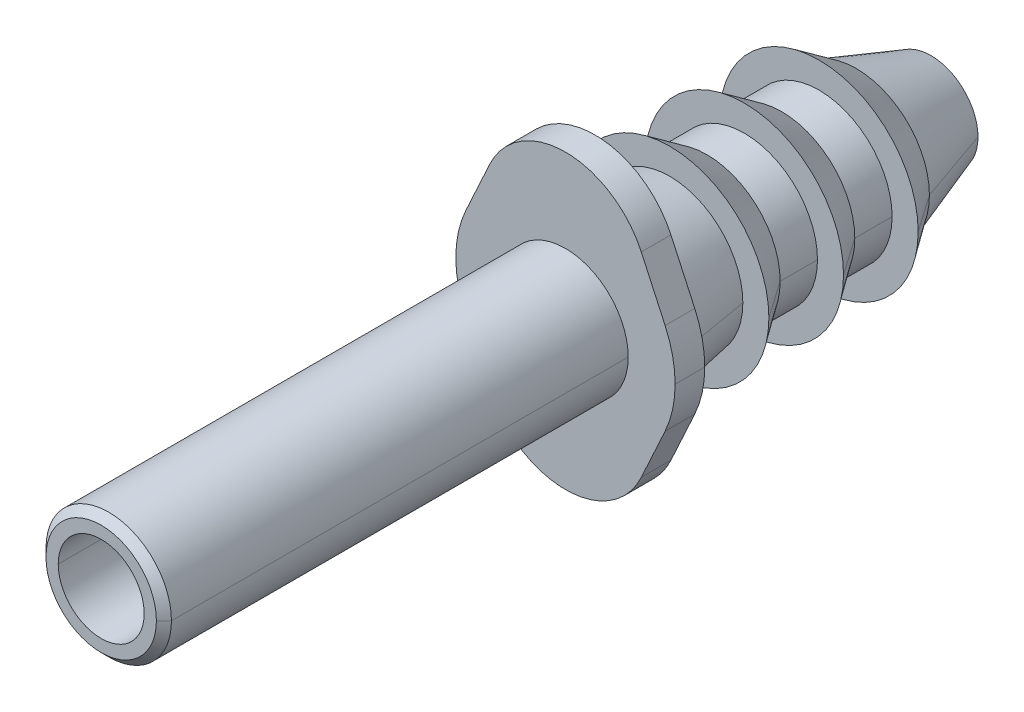
ISO-10303-21;
HEADER;
FILE_DESCRIPTION(('STEP AP214'),'2;1');
FILE_NAME('part.step','',(''),(''),'','','');
FILE_SCHEMA(('AUTOMOTIVE_DESIGN { 1 0 10303 214 1 1 1 1 }'));
ENDSEC;
DATA;
#1=APPLICATION_CONTEXT('core data for automotive mechanical design processes');
#2=APPLICATION_PROTOCOL_DEFINITION('international standard','automotive_design',2000,#1);
#3=PRODUCT_CONTEXT('',#1,'mechanical');
#4=PRODUCT('Part','Part','',(#3));
#5=PRODUCT_RELATED_PRODUCT_CATEGORY('part','',(#4));
#6=PRODUCT_DEFINITION_FORMATION('','',#4);
#7=PRODUCT_DEFINITION_CONTEXT('part definition',#1,'design');
#8=PRODUCT_DEFINITION('design','',#6,#7);
#9=PRODUCT_DEFINITION_SHAPE('','',#8);
#10=(LENGTH_UNIT() NAMED_UNIT(*) SI_UNIT(.MILLI.,.METRE.));
#11=(NAMED_UNIT(*) PLANE_ANGLE_UNIT() SI_UNIT($,.RADIAN.));
#12=(NAMED_UNIT(*) SI_UNIT($,.STERADIAN.) SOLID_ANGLE_UNIT());
#13=UNCERTAINTY_MEASURE_WITH_UNIT(LENGTH_MEASURE(1.E-05),#10,'distance_accuracy_value','');
#14=(GEOMETRIC_REPRESENTATION_CONTEXT(3) GLOBAL_UNCERTAINTY_ASSIGNED_CONTEXT((#13)) GLOBAL_UNIT_ASSIGNED_CONTEXT((#10,
#11,#12)) REPRESENTATION_CONTEXT('',''));
#15=CARTESIAN_POINT('',(0.,0.,0.));
#16=DIRECTION('',(0.,0.,1.));
#17=DIRECTION('',(1.,0.,0.));
#18=AXIS2_PLACEMENT_3D('',#15,#16,#17);
#19=CARTESIAN_POINT('',(3.83950382648321,-4.93818897637795,-21.));
#20=DIRECTION('',(0.908758302126205,-0.41732283464567,0.));
#21=DIRECTION('',(0.,0.,-1.));
#22=AXIS2_PLACEMENT_3D('',#19,#20,#21);
#23=PLANE('',#22);
#24=DIRECTION('',(-0.41732283464567,-0.908758302126205,0.));
#25=VECTOR('',#24,1.);
#26=CARTESIAN_POINT('',(6.24771332711766,0.305905511811019,-2.5));
#27=LINE('',#26,#25);
#28=CARTESIAN_POINT('',(5.04360857680044,-2.31614173228347,-2.5));
#29=VERTEX_POINT('',#28);
#30=CARTESIAN_POINT('',(3.83950382648321,-4.93818897637795,-2.5));
#31=VERTEX_POINT('',#30);
#32=EDGE_CURVE('E406',#29,#31,#27,.T.);
#33=ORIENTED_EDGE('',*,*,#32,.T.);
#34=DIRECTION('',(0.,0.,1.));
#35=VECTOR('',#34,1.);
#36=CARTESIAN_POINT('',(3.83950382648321,-4.93818897637795,-21.));
#37=LINE('',#36,#35);
#38=CARTESIAN_POINT('',(3.83950382648321,-4.93818897637795,-4.));
#39=VERTEX_POINT('',#38);
#40=EDGE_CURVE('E315',#39,#31,#37,.T.);
#41=ORIENTED_EDGE('',*,*,#40,.F.);
#42=DIRECTION('',(0.41732283464567,0.908758302126205,0.));
#43=VECTOR('',#42,1.);
#44=CARTESIAN_POINT('',(6.69688232354505,1.28401171802343,-4.));
#45=LINE('',#44,#43);
#46=CARTESIAN_POINT('',(5.04360857680044,-2.31614173228347,-4.));
#47=VERTEX_POINT('',#46);
#48=EDGE_CURVE('E325',#39,#47,#45,.T.);
#49=ORIENTED_EDGE('',*,*,#48,.T.);
#50=DIRECTION('',(0.,0.,1.));
#51=VECTOR('',#50,1.);
#52=CARTESIAN_POINT('',(5.04360857680044,-2.31614173228347,-21.));
#53=LINE('',#52,#51);
#54=EDGE_CURVE('E507',#47,#29,#53,.T.);
#55=ORIENTED_EDGE('',*,*,#54,.T.);
#56=EDGE_LOOP('',(#33,#41,#49,#55));
#57=FACE_BOUND('',#56,.T.);
#58=ADVANCED_FACE('F16',(#57),#23,.T.);
#59=CARTESIAN_POINT('',(0.,0.,-21.));
#60=DIRECTION('',(0.,0.,1.));
#61=DIRECTION('',(1.,0.,0.));
#62=AXIS2_PLACEMENT_3D('',#59,#60,#61);
#63=CYLINDRICAL_SURFACE('',#62,5.55);
#64=DIRECTION('',(0.,0.,1.));
#65=VECTOR('',#64,1.);
#66=CARTESIAN_POINT('',(5.55,0.,-21.));
#67=LINE('',#66,#65);
#68=CARTESIAN_POINT('',(5.55,0.,-4.));
#69=VERTEX_POINT('',#68);
#70=CARTESIAN_POINT('',(5.55,0.,-2.5));
#71=VERTEX_POINT('',#70);
#72=EDGE_CURVE('E519',#69,#71,#67,.T.);
#73=ORIENTED_EDGE('',*,*,#72,.F.);
#74=CARTESIAN_POINT('',(0.,0.,-4.));
#75=DIRECTION('',(0.,0.,1.));
#76=DIRECTION('',(1.,0.,0.));
#77=AXIS2_PLACEMENT_3D('',#74,#75,#76);
#78=CIRCLE('',#77,5.55);
#79=CARTESIAN_POINT('',(5.04360857680044,2.31614173228346,-4.));
#80=VERTEX_POINT('',#79);
#81=EDGE_CURVE('E329',#69,#80,#78,.T.);
#82=ORIENTED_EDGE('',*,*,#81,.T.);
#83=DIRECTION('',(0.,0.,1.));
#84=VECTOR('',#83,1.);
#85=CARTESIAN_POINT('',(5.04360857680044,2.31614173228346,-21.));
#86=LINE('',#85,#84);
#87=CARTESIAN_POINT('',(5.04360857680044,2.31614173228346,-2.5));
#88=VERTEX_POINT('',#87);
#89=EDGE_CURVE('E10',#80,#88,#86,.T.);
#90=ORIENTED_EDGE('',*,*,#89,.T.);
#91=CARTESIAN_POINT('',(0.,0.,-2.5));
#92=DIRECTION('',(0.,0.,-1.));
#93=DIRECTION('',(-1.,0.,0.));
#94=AXIS2_PLACEMENT_3D('',#91,#92,#93);
#95=CIRCLE('',#94,5.55);
#96=EDGE_CURVE('E415',#88,#71,#95,.T.);
#97=ORIENTED_EDGE('',*,*,#96,.T.);
#98=EDGE_LOOP('',(#73,#82,#90,#97));
#99=FACE_BOUND('',#98,.T.);
#100=ADVANCED_FACE('F604',(#99),#63,.T.);
#101=CARTESIAN_POINT('',(5.04360857680044,2.31614173228346,-21.));
#102=DIRECTION('',(0.908758302126205,0.41732283464567,0.));
#103=DIRECTION('',(0.,0.,-1.));
#104=AXIS2_PLACEMENT_3D('',#101,#102,#103);
#105=PLANE('',#104);
#106=DIRECTION('',(0.41732283464567,-0.908758302126205,0.));
#107=VECTOR('',#106,1.);
#108=CARTESIAN_POINT('',(3.83950382648321,4.93818897637795,-2.5));
#109=LINE('',#108,#107);
#110=CARTESIAN_POINT('',(3.83950382648321,4.93818897637795,-2.5));
#111=VERTEX_POINT('',#110);
#112=EDGE_CURVE('E403',#111,#88,#109,.T.);
#113=ORIENTED_EDGE('',*,*,#112,.T.);
#114=ORIENTED_EDGE('',*,*,#89,.F.);
#115=DIRECTION('',(-0.41732283464567,0.908758302126205,0.));
#116=VECTOR('',#115,1.);
#117=CARTESIAN_POINT('',(3.39033483005583,5.91629518259037,-4.));
#118=LINE('',#117,#116);
#119=CARTESIAN_POINT('',(3.83950382648321,4.93818897637795,-4.));
#120=VERTEX_POINT('',#119);
#121=EDGE_CURVE('E408',#80,#120,#118,.T.);
#122=ORIENTED_EDGE('',*,*,#121,.T.);
#123=DIRECTION('',(0.,0.,1.));
#124=VECTOR('',#123,1.);
#125=CARTESIAN_POINT('',(3.83950382648321,4.93818897637795,-21.));
#126=LINE('',#125,#124);
#127=EDGE_CURVE('E20',#120,#111,#126,.T.);
#128=ORIENTED_EDGE('',*,*,#127,.T.);
#129=EDGE_LOOP('',(#113,#114,#122,#128));
#130=FACE_BOUND('',#129,.T.);
#131=ADVANCED_FACE('F609',(#130),#105,.T.);
#132=CARTESIAN_POINT('',(0.,3.175,-21.));
#133=DIRECTION('',(0.,0.,1.));
#134=DIRECTION('',(1.,0.,0.));
#135=AXIS2_PLACEMENT_3D('',#132,#133,#134);
#136=CYLINDRICAL_SURFACE('',#135,4.225);
#137=CARTESIAN_POINT('',(0.,3.175,-2.5));
#138=DIRECTION('',(0.,0.,-1.));
#139=DIRECTION('',(-1.,0.,0.));
#140=AXIS2_PLACEMENT_3D('',#137,#138,#139);
#141=CIRCLE('',#140,4.225);
#142=CARTESIAN_POINT('',(-3.83950382648321,4.93818897637795,-2.5));
#143=VERTEX_POINT('',#142);
#144=EDGE_CURVE('E286',#143,#111,#141,.T.);
#145=ORIENTED_EDGE('',*,*,#144,.T.);
#146=ORIENTED_EDGE('',*,*,#127,.F.);
#147=CARTESIAN_POINT('',(0.,3.175,-4.));
#148=DIRECTION('',(0.,0.,1.));
#149=DIRECTION('',(1.,0.,0.));
#150=AXIS2_PLACEMENT_3D('',#147,#148,#149);
#151=CIRCLE('',#150,4.225);
#152=CARTESIAN_POINT('',(-3.83950382648321,4.93818897637795,-4.));
#153=VERTEX_POINT('',#152);
#154=EDGE_CURVE('E411',#120,#153,#151,.T.);
#155=ORIENTED_EDGE('',*,*,#154,.T.);
#156=DIRECTION('',(0.,0.,1.));
#157=VECTOR('',#156,1.);
#158=CARTESIAN_POINT('',(-3.83950382648321,4.93818897637795,-21.));
#159=LINE('',#158,#157);
#160=EDGE_CURVE('E468',#153,#143,#159,.T.);
#161=ORIENTED_EDGE('',*,*,#160,.T.);
#162=EDGE_LOOP('',(#145,#146,#155,#161));
#163=FACE_BOUND('',#162,.T.);
#164=ADVANCED_FACE('F18',(#163),#136,.T.);
#165=CARTESIAN_POINT('',(-3.83950382648321,4.93818897637795,-21.));
#166=DIRECTION('',(-0.908758302126205,0.417322834645669,0.));
#167=DIRECTION('',(0.,0.,1.));
#168=AXIS2_PLACEMENT_3D('',#165,#166,#167);
#169=PLANE('',#168);
#170=DIRECTION('',(0.41732283464567,0.908758302126205,0.));
#171=VECTOR('',#170,1.);
#172=CARTESIAN_POINT('',(-3.83950382648321,4.93818897637795,-2.5));
#173=LINE('',#172,#171);
#174=CARTESIAN_POINT('',(-5.04360857680044,2.31614173228346,-2.5));
#175=VERTEX_POINT('',#174);
#176=EDGE_CURVE('E281',#175,#143,#173,.T.);
#177=ORIENTED_EDGE('',*,*,#176,.T.);
#178=ORIENTED_EDGE('',*,*,#160,.F.);
#179=DIRECTION('',(-0.41732283464567,-0.908758302126205,0.));
#180=VECTOR('',#179,1.);
#181=CARTESIAN_POINT('',(-3.39033483005583,5.91629518259037,-4.));
#182=LINE('',#181,#180);
#183=CARTESIAN_POINT('',(-5.04360857680044,2.31614173228346,-4.));
#184=VERTEX_POINT('',#183);
#185=EDGE_CURVE('E418',#153,#184,#182,.T.);
#186=ORIENTED_EDGE('',*,*,#185,.T.);
#187=DIRECTION('',(0.,0.,1.));
#188=VECTOR('',#187,1.);
#189=CARTESIAN_POINT('',(-5.04360857680044,2.31614173228346,-21.));
#190=LINE('',#189,#188);
#191=EDGE_CURVE('E471',#184,#175,#190,.T.);
#192=ORIENTED_EDGE('',*,*,#191,.T.);
#193=EDGE_LOOP('',(#177,#178,#186,#192));
#194=FACE_BOUND('',#193,.T.);
#195=ADVANCED_FACE('F478',(#194),#169,.T.);
#196=CARTESIAN_POINT('',(0.,0.,-21.));
#197=DIRECTION('',(0.,0.,1.));
#198=DIRECTION('',(1.,0.,0.));
#199=AXIS2_PLACEMENT_3D('',#196,#197,#198);
#200=CYLINDRICAL_SURFACE('',#199,5.55);
#201=CARTESIAN_POINT('',(0.,0.,-2.5));
#202=DIRECTION('',(0.,0.,-1.));
#203=DIRECTION('',(-1.,0.,0.));
#204=AXIS2_PLACEMENT_3D('',#201,#202,#203);
#205=CIRCLE('',#204,5.55);
#206=CARTESIAN_POINT('',(-5.04360857680044,-2.31614173228346,-2.5));
#207=VERTEX_POINT('',#206);
#208=EDGE_CURVE('E285',#207,#175,#205,.T.);
#209=ORIENTED_EDGE('',*,*,#208,.T.);
#210=ORIENTED_EDGE('',*,*,#191,.F.);
#211=CARTESIAN_POINT('',(0.,0.,-4.));
#212=DIRECTION('',(0.,0.,1.));
#213=DIRECTION('',(1.,0.,0.));
#214=AXIS2_PLACEMENT_3D('',#211,#212,#213);
#215=CIRCLE('',#214,5.55);
#216=CARTESIAN_POINT('',(-5.04360857680044,-2.31614173228346,-4.));
#217=VERTEX_POINT('',#216);
#218=EDGE_CURVE('E433',#184,#217,#215,.T.);
#219=ORIENTED_EDGE('',*,*,#218,.T.);
#220=DIRECTION('',(0.,0.,1.));
#221=VECTOR('',#220,1.);
#222=CARTESIAN_POINT('',(-5.04360857680044,-2.31614173228346,-21.));
#223=LINE('',#222,#221);
#224=EDGE_CURVE('E318',#217,#207,#223,.T.);
#225=ORIENTED_EDGE('',*,*,#224,.T.);
#226=EDGE_LOOP('',(#209,#210,#219,#225));
#227=FACE_BOUND('',#226,.T.);
#228=ADVANCED_FACE('F485',(#227),#200,.T.);
#229=CARTESIAN_POINT('',(-5.04360857680044,-2.31614173228346,-21.));
#230=DIRECTION('',(-0.908758302126205,-0.417322834645669,0.));
#231=DIRECTION('',(-0.417322834645669,0.908758302126205,0.));
#232=AXIS2_PLACEMENT_3D('',#229,#230,#231);
#233=PLANE('',#232);
#234=DIRECTION('',(-0.41732283464567,0.908758302126205,0.));
#235=VECTOR('',#234,1.);
#236=CARTESIAN_POINT('',(-6.24771332711766,0.305905511811021,-2.5));
#237=LINE('',#236,#235);
#238=CARTESIAN_POINT('',(-3.83950382648321,-4.93818897637795,-2.5));
#239=VERTEX_POINT('',#238);
#240=EDGE_CURVE('E396',#239,#207,#237,.T.);
#241=ORIENTED_EDGE('',*,*,#240,.T.);
#242=ORIENTED_EDGE('',*,*,#224,.F.);
#243=DIRECTION('',(0.41732283464567,-0.908758302126205,0.));
#244=VECTOR('',#243,1.);
#245=CARTESIAN_POINT('',(-6.69688232354505,1.28401171802343,-4.));
#246=LINE('',#245,#244);
#247=CARTESIAN_POINT('',(-3.83950382648321,-4.93818897637795,-4.));
#248=VERTEX_POINT('',#247);
#249=EDGE_CURVE('E429',#217,#248,#246,.T.);
#250=ORIENTED_EDGE('',*,*,#249,.T.);
#251=DIRECTION('',(0.,0.,1.));
#252=VECTOR('',#251,1.);
#253=CARTESIAN_POINT('',(-3.83950382648321,-4.93818897637795,-21.));
#254=LINE('',#253,#252);
#255=EDGE_CURVE('E319',#248,#239,#254,.T.);
#256=ORIENTED_EDGE('',*,*,#255,.T.);
#257=EDGE_LOOP('',(#241,#242,#250,#256));
#258=FACE_BOUND('',#257,.T.);
#259=ADVANCED_FACE('F499',(#258),#233,.T.);
#260=CARTESIAN_POINT('',(0.,-3.175,-21.));
#261=DIRECTION('',(0.,0.,1.));
#262=DIRECTION('',(1.,0.,0.));
#263=AXIS2_PLACEMENT_3D('',#260,#261,#262);
#264=CYLINDRICAL_SURFACE('',#263,4.225);
#265=CARTESIAN_POINT('',(0.,-3.175,-2.5));
#266=DIRECTION('',(0.,0.,-1.));
#267=DIRECTION('',(-1.,0.,0.));
#268=AXIS2_PLACEMENT_3D('',#265,#266,#267);
#269=CIRCLE('',#268,4.225);
#270=EDGE_CURVE('E400',#31,#239,#269,.T.);
#271=ORIENTED_EDGE('',*,*,#270,.T.);
#272=ORIENTED_EDGE('',*,*,#255,.F.);
#273=CARTESIAN_POINT('',(0.,-3.175,-4.));
#274=DIRECTION('',(0.,0.,1.));
#275=DIRECTION('',(1.,0.,0.));
#276=AXIS2_PLACEMENT_3D('',#273,#274,#275);
#277=CIRCLE('',#276,4.225);
#278=EDGE_CURVE('E362',#248,#39,#277,.T.);
#279=ORIENTED_EDGE('',*,*,#278,.T.);
#280=ORIENTED_EDGE('',*,*,#40,.T.);
#281=EDGE_LOOP('',(#271,#272,#279,#280));
#282=FACE_BOUND('',#281,.T.);
#283=ADVANCED_FACE('F504',(#282),#264,.T.);
#284=CARTESIAN_POINT('',(0.,0.,21.));
#285=DIRECTION('',(0.,0.,-1.));
#286=DIRECTION('',(-1.,0.,0.));
#287=AXIS2_PLACEMENT_3D('',#284,#285,#286);
#288=CONICAL_SURFACE('',#287,2.794,0.785398163397442);
#289=DIRECTION('',(0.707106781186544,0.,-0.707106781186552));
#290=VECTOR('',#289,1.);
#291=CARTESIAN_POINT('',(2.794,0.,21.));
#292=LINE('',#291,#290);
#293=CARTESIAN_POINT('',(2.794,0.,21.));
#294=VERTEX_POINT('',#293);
#295=CARTESIAN_POINT('',(3.175,0.,20.619));
#296=VERTEX_POINT('',#295);
#297=EDGE_CURVE('E531',#294,#296,#292,.T.);
#298=ORIENTED_EDGE('',*,*,#297,.F.);
#299=CARTESIAN_POINT('',(0.,0.,21.));
#300=DIRECTION('',(0.,0.,1.));
#301=DIRECTION('',(-1.,0.,0.));
#302=AXIS2_PLACEMENT_3D('',#299,#300,#301);
#303=CIRCLE('',#302,2.794);
#304=CARTESIAN_POINT('',(-2.794,0.,21.));
#305=VERTEX_POINT('',#304);
#306=EDGE_CURVE('E447',#305,#294,#303,.T.);
#307=ORIENTED_EDGE('',*,*,#306,.F.);
#308=DIRECTION('',(-0.707106781186544,0.,-0.707106781186552));
#309=VECTOR('',#308,1.);
#310=CARTESIAN_POINT('',(-2.794,0.,21.));
#311=LINE('',#310,#309);
#312=CARTESIAN_POINT('',(-3.175,0.,20.619));
#313=VERTEX_POINT('',#312);
#314=EDGE_CURVE('E537',#305,#313,#311,.T.);
#315=ORIENTED_EDGE('',*,*,#314,.T.);
#316=CARTESIAN_POINT('',(0.,0.,20.619));
#317=DIRECTION('',(0.,0.,-1.));
#318=DIRECTION('',(-1.,0.,0.));
#319=AXIS2_PLACEMENT_3D('',#316,#317,#318);
#320=CIRCLE('',#319,3.175);
#321=EDGE_CURVE('E451',#296,#313,#320,.T.);
#322=ORIENTED_EDGE('',*,*,#321,.F.);
#323=EDGE_LOOP('',(#298,#307,#315,#322));
#324=FACE_BOUND('',#323,.T.);
#325=ADVANCED_FACE('F685',(#324),#288,.T.);
#326=CARTESIAN_POINT('',(0.,0.,21.));
#327=DIRECTION('',(0.,0.,1.));
#328=DIRECTION('',(1.,0.,0.));
#329=AXIS2_PLACEMENT_3D('',#326,#327,#328);
#330=CYLINDRICAL_SURFACE('',#329,2.175);
#331=DIRECTION('',(0.,0.,1.));
#332=VECTOR('',#331,1.);
#333=CARTESIAN_POINT('',(-2.175,0.,21.));
#334=LINE('',#333,#332);
#335=CARTESIAN_POINT('',(-2.175,0.,-21.));
#336=VERTEX_POINT('',#335);
#337=CARTESIAN_POINT('',(-2.175,0.,21.));
#338=VERTEX_POINT('',#337);
#339=EDGE_CURVE('E553',#336,#338,#334,.T.);
#340=ORIENTED_EDGE('',*,*,#339,.F.);
#341=CARTESIAN_POINT('',(0.,0.,-21.));
#342=DIRECTION('',(0.,0.,1.));
#343=DIRECTION('',(1.,0.,0.));
#344=AXIS2_PLACEMENT_3D('',#341,#342,#343);
#345=CIRCLE('',#344,2.175);
#346=CARTESIAN_POINT('',(2.175,0.,-21.));
#347=VERTEX_POINT('',#346);
#348=EDGE_CURVE('E253',#347,#336,#345,.T.);
#349=ORIENTED_EDGE('',*,*,#348,.F.);
#350=DIRECTION('',(0.,0.,1.));
#351=VECTOR('',#350,1.);
#352=CARTESIAN_POINT('',(2.175,0.,21.));
#353=LINE('',#352,#351);
#354=CARTESIAN_POINT('',(2.175,0.,21.));
#355=VERTEX_POINT('',#354);
#356=EDGE_CURVE('E266',#347,#355,#353,.T.);
#357=ORIENTED_EDGE('',*,*,#356,.T.);
#358=CARTESIAN_POINT('',(0.,0.,21.));
#359=DIRECTION('',(0.,0.,1.));
#360=DIRECTION('',(1.,0.,0.));
#361=AXIS2_PLACEMENT_3D('',#358,#359,#360);
#362=CIRCLE('',#361,2.175);
#363=EDGE_CURVE('E448',#355,#338,#362,.T.);
#364=ORIENTED_EDGE('',*,*,#363,.T.);
#365=EDGE_LOOP('',(#340,#349,#357,#364));
#366=FACE_BOUND('',#365,.T.);
#367=ADVANCED_FACE('F655',(#366),#330,.F.);
#368=CARTESIAN_POINT('',(0.,2.38125,-21.));
#369=DIRECTION('',(0.,0.,1.));
#370=DIRECTION('',(1.,0.,0.));
#371=AXIS2_PLACEMENT_3D('',#368,#369,#370);
#372=PLANE('',#371);
#373=ORIENTED_EDGE('',*,*,#348,.T.);
#374=CARTESIAN_POINT('',(0.,0.,-21.));
#375=DIRECTION('',(0.,0.,1.));
#376=DIRECTION('',(1.,0.,0.));
#377=AXIS2_PLACEMENT_3D('',#374,#375,#376);
#378=CIRCLE('',#377,2.175);
#379=EDGE_CURVE('E549',#336,#347,#378,.T.);
#380=ORIENTED_EDGE('',*,*,#379,.T.);
#381=EDGE_LOOP('',(#373,#380));
#382=FACE_BOUND('',#381,.T.);
#383=CARTESIAN_POINT('',(0.,0.,-21.));
#384=DIRECTION('',(0.,0.,1.));
#385=DIRECTION('',(1.,0.,0.));
#386=AXIS2_PLACEMENT_3D('',#383,#384,#385);
#387=CIRCLE('',#386,2.38125);
#388=CARTESIAN_POINT('',(2.38125,0.,-21.));
#389=VERTEX_POINT('',#388);
#390=CARTESIAN_POINT('',(-2.38125,0.,-21.));
#391=VERTEX_POINT('',#390);
#392=EDGE_CURVE('E258',#389,#391,#387,.T.);
#393=ORIENTED_EDGE('',*,*,#392,.F.);
#394=CARTESIAN_POINT('',(0.,0.,-21.));
#395=DIRECTION('',(0.,0.,1.));
#396=DIRECTION('',(1.,0.,0.));
#397=AXIS2_PLACEMENT_3D('',#394,#395,#396);
#398=CIRCLE('',#397,2.38125);
#399=EDGE_CURVE('E242',#391,#389,#398,.T.);
#400=ORIENTED_EDGE('',*,*,#399,.F.);
#401=EDGE_LOOP('',(#393,#400));
#402=FACE_BOUND('',#401,.T.);
#403=ADVANCED_FACE('F264',(#382,#402),#372,.F.);
#404=CARTESIAN_POINT('',(0.,0.,-21.));
#405=DIRECTION('',(0.,0.,1.));
#406=DIRECTION('',(1.,0.,0.));
#407=AXIS2_PLACEMENT_3D('',#404,#405,#406);
#408=CONICAL_SURFACE('',#407,2.38125,0.335855771794821);
#409=DIRECTION('',(-0.329577249094696,0.,0.944128612467164));
#410=VECTOR('',#409,1.);
#411=CARTESIAN_POINT('',(-2.38125,0.,-21.));
#412=LINE('',#411,#410);
#413=CARTESIAN_POINT('',(-3.7,0.,-17.2222222222222));
#414=VERTEX_POINT('',#413);
#415=EDGE_CURVE('E248',#391,#414,#412,.T.);
#416=ORIENTED_EDGE('',*,*,#415,.F.);
#417=ORIENTED_EDGE('',*,*,#399,.T.);
#418=DIRECTION('',(0.329577249094696,0.,0.944128612467164));
#419=VECTOR('',#418,1.);
#420=CARTESIAN_POINT('',(2.38125,0.,-21.));
#421=LINE('',#420,#419);
#422=CARTESIAN_POINT('',(3.7,0.,-17.2222222222222));
#423=VERTEX_POINT('',#422);
#424=EDGE_CURVE('E245',#389,#423,#421,.T.);
#425=ORIENTED_EDGE('',*,*,#424,.T.);
#426=CARTESIAN_POINT('',(0.,0.,-17.2222222222222));
#427=DIRECTION('',(0.,0.,1.));
#428=DIRECTION('',(1.,0.,0.));
#429=AXIS2_PLACEMENT_3D('',#426,#427,#428);
#430=CIRCLE('',#429,3.7);
#431=EDGE_CURVE('E254',#414,#423,#430,.T.);
#432=ORIENTED_EDGE('',*,*,#431,.F.);
#433=EDGE_LOOP('',(#416,#417,#425,#432));
#434=FACE_BOUND('',#433,.T.);
#435=ADVANCED_FACE('F244',(#434),#408,.T.);
#436=CARTESIAN_POINT('',(0.,0.,-17.2222222222222));
#437=DIRECTION('',(0.,0.,1.));
#438=DIRECTION('',(1.,0.,0.));
#439=AXIS2_PLACEMENT_3D('',#436,#437,#438);
#440=CONICAL_SURFACE('',#439,3.7,0.60949118369653);
#441=DIRECTION('',(-0.572450335687909,0.,0.819939396035342));
#442=VECTOR('',#441,1.);
#443=CARTESIAN_POINT('',(-3.7,0.,-17.2222222222222));
#444=LINE('',#443,#442);
#445=CARTESIAN_POINT('',(-5.01875,0.,-15.3333333333333));
#446=VERTEX_POINT('',#445);
#447=EDGE_CURVE('E262',#414,#446,#444,.T.);
#448=ORIENTED_EDGE('',*,*,#447,.F.);
#449=ORIENTED_EDGE('',*,*,#431,.T.);
#450=DIRECTION('',(0.572450335687909,0.,0.819939396035342));
#451=VECTOR('',#450,1.);
#452=CARTESIAN_POINT('',(3.7,0.,-17.2222222222222));
#453=LINE('',#452,#451);
#454=CARTESIAN_POINT('',(5.01875,0.,-15.3333333333333));
#455=VERTEX_POINT('',#454);
#456=EDGE_CURVE('E294',#423,#455,#453,.T.);
#457=ORIENTED_EDGE('',*,*,#456,.T.);
#458=CARTESIAN_POINT('',(0.,0.,-15.3333333333333));
#459=DIRECTION('',(0.,0.,1.));
#460=DIRECTION('',(1.,0.,0.));
#461=AXIS2_PLACEMENT_3D('',#458,#459,#460);
#462=CIRCLE('',#461,5.01875);
#463=EDGE_CURVE('E461',#446,#455,#462,.T.);
#464=ORIENTED_EDGE('',*,*,#463,.F.);
#465=EDGE_LOOP('',(#448,#449,#457,#464));
#466=FACE_BOUND('',#465,.T.);
#467=ADVANCED_FACE('F1067',(#466),#440,.T.);
#468=CARTESIAN_POINT('',(0.,3.7,-15.3333333333333));
#469=DIRECTION('',(0.,0.,-1.));
#470=DIRECTION('',(0.,-1.,0.));
#471=AXIS2_PLACEMENT_3D('',#468,#469,#470);
#472=PLANE('',#471);
#473=CARTESIAN_POINT('',(0.,0.,-15.3333333333333));
#474=DIRECTION('',(0.,0.,1.));
#475=DIRECTION('',(1.,0.,0.));
#476=AXIS2_PLACEMENT_3D('',#473,#474,#475);
#477=CIRCLE('',#476,3.7);
#478=CARTESIAN_POINT('',(3.7,0.,-15.3333333333333));
#479=VERTEX_POINT('',#478);
#480=CARTESIAN_POINT('',(-3.7,0.,-15.3333333333333));
#481=VERTEX_POINT('',#480);
#482=EDGE_CURVE('E298',#479,#481,#477,.T.);
#483=ORIENTED_EDGE('',*,*,#482,.F.);
#484=CARTESIAN_POINT('',(0.,0.,-15.3333333333333));
#485=DIRECTION('',(0.,0.,1.));
#486=DIRECTION('',(1.,0.,0.));
#487=AXIS2_PLACEMENT_3D('',#484,#485,#486);
#488=CIRCLE('',#487,3.7);
#489=EDGE_CURVE('E442',#481,#479,#488,.T.);
#490=ORIENTED_EDGE('',*,*,#489,.F.);
#491=EDGE_LOOP('',(#483,#490));
#492=FACE_BOUND('',#491,.T.);
#493=CARTESIAN_POINT('',(0.,0.,-15.3333333333333));
#494=DIRECTION('',(0.,0.,1.));
#495=DIRECTION('',(1.,0.,0.));
#496=AXIS2_PLACEMENT_3D('',#493,#494,#495);
#497=CIRCLE('',#496,5.01875);
#498=EDGE_CURVE('E290',#455,#446,#497,.T.);
#499=ORIENTED_EDGE('',*,*,#498,.T.);
#500=ORIENTED_EDGE('',*,*,#463,.T.);
#501=EDGE_LOOP('',(#499,#500));
#502=FACE_BOUND('',#501,.T.);
#503=ADVANCED_FACE('F1058',(#492,#502),#472,.F.);
#504=CARTESIAN_POINT('',(0.,0.,21.));
#505=DIRECTION('',(0.,0.,1.));
#506=DIRECTION('',(1.,0.,0.));
#507=AXIS2_PLACEMENT_3D('',#504,#505,#506);
#508=CYLINDRICAL_SURFACE('',#507,3.7);
#509=DIRECTION('',(0.,0.,1.));
#510=VECTOR('',#509,1.);
#511=CARTESIAN_POINT('',(-3.7,0.,21.));
#512=LINE('',#511,#510);
#513=CARTESIAN_POINT('',(-3.7,0.,-13.4444444444444));
#514=VERTEX_POINT('',#513);
#515=EDGE_CURVE('E302',#481,#514,#512,.T.);
#516=ORIENTED_EDGE('',*,*,#515,.F.);
#517=ORIENTED_EDGE('',*,*,#489,.T.);
#518=DIRECTION('',(0.,0.,1.));
#519=VECTOR('',#518,1.);
#520=CARTESIAN_POINT('',(3.7,0.,21.));
#521=LINE('',#520,#519);
#522=CARTESIAN_POINT('',(3.7,0.,-13.4444444444444));
#523=VERTEX_POINT('',#522);
#524=EDGE_CURVE('E278',#479,#523,#521,.T.);
#525=ORIENTED_EDGE('',*,*,#524,.T.);
#526=CARTESIAN_POINT('',(0.,0.,-13.4444444444444));
#527=DIRECTION('',(0.,0.,1.));
#528=DIRECTION('',(1.,0.,0.));
#529=AXIS2_PLACEMENT_3D('',#526,#527,#528);
#530=CIRCLE('',#529,3.7);
#531=EDGE_CURVE('E369',#514,#523,#530,.T.);
#532=ORIENTED_EDGE('',*,*,#531,.F.);
#533=EDGE_LOOP('',(#516,#517,#525,#532));
#534=FACE_BOUND('',#533,.T.);
#535=ADVANCED_FACE('F1049',(#534),#508,.T.);
#536=CARTESIAN_POINT('',(0.,0.,-13.4444444444444));
#537=DIRECTION('',(0.,0.,1.));
#538=DIRECTION('',(1.,0.,0.));
#539=AXIS2_PLACEMENT_3D('',#536,#537,#538);
#540=CONICAL_SURFACE('',#539,3.7,0.609491183696531);
#541=DIRECTION('',(-0.57245033568791,0.,0.819939396035341));
#542=VECTOR('',#541,1.);
#543=CARTESIAN_POINT('',(-3.7,0.,-13.4444444444444));
#544=LINE('',#543,#542);
#545=CARTESIAN_POINT('',(-5.01875,0.,-11.5555555555556));
#546=VERTEX_POINT('',#545);
#547=EDGE_CURVE('E320',#514,#546,#544,.T.);
#548=ORIENTED_EDGE('',*,*,#547,.F.);
#549=ORIENTED_EDGE('',*,*,#531,.T.);
#550=DIRECTION('',(0.57245033568791,0.,0.819939396035341));
#551=VECTOR('',#550,1.);
#552=CARTESIAN_POINT('',(3.7,0.,-13.4444444444444));
#553=LINE('',#552,#551);
#554=CARTESIAN_POINT('',(5.01875,0.,-11.5555555555556));
#555=VERTEX_POINT('',#554);
#556=EDGE_CURVE('E333',#523,#555,#553,.T.);
#557=ORIENTED_EDGE('',*,*,#556,.T.);
#558=CARTESIAN_POINT('',(0.,0.,-11.5555555555556));
#559=DIRECTION('',(0.,0.,1.));
#560=DIRECTION('',(1.,0.,0.));
#561=AXIS2_PLACEMENT_3D('',#558,#559,#560);
#562=CIRCLE('',#561,5.01875);
#563=EDGE_CURVE('E306',#546,#555,#562,.T.);
#564=ORIENTED_EDGE('',*,*,#563,.F.);
#565=EDGE_LOOP('',(#548,#549,#557,#564));
#566=FACE_BOUND('',#565,.T.);
#567=ADVANCED_FACE('F1040',(#566),#540,.T.);
#568=CARTESIAN_POINT('',(0.,3.7,-11.5555555555556));
#569=DIRECTION('',(0.,0.,-1.));
#570=DIRECTION('',(0.,-1.,0.));
#571=AXIS2_PLACEMENT_3D('',#568,#569,#570);
#572=PLANE('',#571);
#573=CARTESIAN_POINT('',(0.,0.,-11.5555555555556));
#574=DIRECTION('',(0.,0.,1.));
#575=DIRECTION('',(1.,0.,0.));
#576=AXIS2_PLACEMENT_3D('',#573,#574,#575);
#577=CIRCLE('',#576,3.7);
#578=CARTESIAN_POINT('',(3.7,0.,-11.5555555555556));
#579=VERTEX_POINT('',#578);
#580=CARTESIAN_POINT('',(-3.7,0.,-11.5555555555556));
#581=VERTEX_POINT('',#580);
#582=EDGE_CURVE('E337',#579,#581,#577,.T.);
#583=ORIENTED_EDGE('',*,*,#582,.F.);
#584=CARTESIAN_POINT('',(0.,0.,-11.5555555555556));
#585=DIRECTION('',(0.,0.,1.));
#586=DIRECTION('',(1.,0.,0.));
#587=AXIS2_PLACEMENT_3D('',#584,#585,#586);
#588=CIRCLE('',#587,3.7);
#589=EDGE_CURVE('E303',#581,#579,#588,.T.);
#590=ORIENTED_EDGE('',*,*,#589,.F.);
#591=EDGE_LOOP('',(#583,#590));
#592=FACE_BOUND('',#591,.T.);
#593=CARTESIAN_POINT('',(0.,0.,-11.5555555555556));
#594=DIRECTION('',(0.,0.,1.));
#595=DIRECTION('',(1.,0.,0.));
#596=AXIS2_PLACEMENT_3D('',#593,#594,#595);
#597=CIRCLE('',#596,5.01875);
#598=EDGE_CURVE('E324',#555,#546,#597,.T.);
#599=ORIENTED_EDGE('',*,*,#598,.T.);
#600=ORIENTED_EDGE('',*,*,#563,.T.);
#601=EDGE_LOOP('',(#599,#600));
#602=FACE_BOUND('',#601,.T.);
#603=ADVANCED_FACE('F1031',(#592,#602),#572,.F.);
#604=CARTESIAN_POINT('',(0.,0.,21.));
#605=DIRECTION('',(0.,0.,1.));
#606=DIRECTION('',(1.,0.,0.));
#607=AXIS2_PLACEMENT_3D('',#604,#605,#606);
#608=CYLINDRICAL_SURFACE('',#607,3.7);
#609=DIRECTION('',(0.,0.,1.));
#610=VECTOR('',#609,1.);
#611=CARTESIAN_POINT('',(-3.7,0.,21.));
#612=LINE('',#611,#610);
#613=CARTESIAN_POINT('',(-3.7,0.,-9.66666666666667));
#614=VERTEX_POINT('',#613);
#615=EDGE_CURVE('E341',#581,#614,#612,.T.);
#616=ORIENTED_EDGE('',*,*,#615,.F.);
#617=ORIENTED_EDGE('',*,*,#589,.T.);
#618=DIRECTION('',(0.,0.,1.));
#619=VECTOR('',#618,1.);
#620=CARTESIAN_POINT('',(3.7,0.,21.));
#621=LINE('',#620,#619);
#622=CARTESIAN_POINT('',(3.7,0.,-9.66666666666667));
#623=VERTEX_POINT('',#622);
#624=EDGE_CURVE('E349',#579,#623,#621,.T.);
#625=ORIENTED_EDGE('',*,*,#624,.T.);
#626=CARTESIAN_POINT('',(0.,0.,-9.66666666666667));
#627=DIRECTION('',(0.,0.,1.));
#628=DIRECTION('',(1.,0.,0.));
#629=AXIS2_PLACEMENT_3D('',#626,#627,#628);
#630=CIRCLE('',#629,3.7);
#631=EDGE_CURVE('E307',#614,#623,#630,.T.);
#632=ORIENTED_EDGE('',*,*,#631,.F.);
#633=EDGE_LOOP('',(#616,#617,#625,#632));
#634=FACE_BOUND('',#633,.T.);
#635=ADVANCED_FACE('F599',(#634),#608,.T.);
#636=CARTESIAN_POINT('',(0.,0.,-9.66666666666667));
#637=DIRECTION('',(0.,0.,1.));
#638=DIRECTION('',(1.,0.,0.));
#639=AXIS2_PLACEMENT_3D('',#636,#637,#638);
#640=CONICAL_SURFACE('',#639,3.7,0.60949118369653);
#641=DIRECTION('',(-0.572450335687909,0.,0.819939396035342));
#642=VECTOR('',#641,1.);
#643=CARTESIAN_POINT('',(-3.7,0.,-9.66666666666667));
#644=LINE('',#643,#642);
#645=CARTESIAN_POINT('',(-5.01875,0.,-7.77777777777777));
#646=VERTEX_POINT('',#645);
#647=EDGE_CURVE('E353',#614,#646,#644,.T.);
#648=ORIENTED_EDGE('',*,*,#647,.F.);
#649=ORIENTED_EDGE('',*,*,#631,.T.);
#650=DIRECTION('',(0.572450335687909,0.,0.819939396035342));
#651=VECTOR('',#650,1.);
#652=CARTESIAN_POINT('',(3.7,0.,-9.66666666666667));
#653=LINE('',#652,#651);
#654=CARTESIAN_POINT('',(5.01875,0.,-7.77777777777777));
#655=VERTEX_POINT('',#654);
#656=EDGE_CURVE('E358',#623,#655,#653,.T.);
#657=ORIENTED_EDGE('',*,*,#656,.T.);
#658=CARTESIAN_POINT('',(0.,0.,-7.77777777777777));
#659=DIRECTION('',(0.,0.,1.));
#660=DIRECTION('',(1.,0.,0.));
#661=AXIS2_PLACEMENT_3D('',#658,#659,#660);
#662=CIRCLE('',#661,5.01875);
#663=EDGE_CURVE('E392',#646,#655,#662,.T.);
#664=ORIENTED_EDGE('',*,*,#663,.F.);
#665=EDGE_LOOP('',(#648,#649,#657,#664));
#666=FACE_BOUND('',#665,.T.);
#667=ADVANCED_FACE('F584',(#666),#640,.T.);
#668=CARTESIAN_POINT('',(0.,3.7,-7.77777777777777));
#669=DIRECTION('',(0.,0.,-1.));
#670=DIRECTION('',(0.,-1.,0.));
#671=AXIS2_PLACEMENT_3D('',#668,#669,#670);
#672=PLANE('',#671);
#673=CARTESIAN_POINT('',(0.,0.,-7.77777777777777));
#674=DIRECTION('',(0.,0.,1.));
#675=DIRECTION('',(1.,0.,0.));
#676=AXIS2_PLACEMENT_3D('',#673,#674,#675);
#677=CIRCLE('',#676,3.7);
#678=CARTESIAN_POINT('',(3.7,0.,-7.77777777777777));
#679=VERTEX_POINT('',#678);
#680=CARTESIAN_POINT('',(-3.7,0.,-7.77777777777777));
#681=VERTEX_POINT('',#680);
#682=EDGE_CURVE('E366',#679,#681,#677,.T.);
#683=ORIENTED_EDGE('',*,*,#682,.F.);
#684=CARTESIAN_POINT('',(0.,0.,-7.77777777777777));
#685=DIRECTION('',(0.,0.,1.));
#686=DIRECTION('',(1.,0.,0.));
#687=AXIS2_PLACEMENT_3D('',#684,#685,#686);
#688=CIRCLE('',#687,3.7);
#689=EDGE_CURVE('E454',#681,#679,#688,.T.);
#690=ORIENTED_EDGE('',*,*,#689,.F.);
#691=EDGE_LOOP('',(#683,#690));
#692=FACE_BOUND('',#691,.T.);
#693=CARTESIAN_POINT('',(0.,0.,-7.77777777777777));
#694=DIRECTION('',(0.,0.,1.));
#695=DIRECTION('',(1.,0.,0.));
#696=AXIS2_PLACEMENT_3D('',#693,#694,#695);
#697=CIRCLE('',#696,5.01875);
#698=EDGE_CURVE('E354',#655,#646,#697,.T.);
#699=ORIENTED_EDGE('',*,*,#698,.T.);
#700=ORIENTED_EDGE('',*,*,#663,.T.);
#701=EDGE_LOOP('',(#699,#700));
#702=FACE_BOUND('',#701,.T.);
#703=ADVANCED_FACE('F586',(#692,#702),#672,.F.);
#704=CARTESIAN_POINT('',(0.,0.,-7.77777777777777));
#705=DIRECTION('',(0.,0.,1.));
#706=DIRECTION('',(1.,0.,0.));
#707=AXIS2_PLACEMENT_3D('',#704,#705,#706);
#708=CONICAL_SURFACE('',#707,3.7,0.1727997286412);
#709=DIRECTION('',(-0.171941052296531,0.,0.985107240119146));
#710=VECTOR('',#709,1.);
#711=CARTESIAN_POINT('',(-3.7,0.,-7.77777777777777));
#712=LINE('',#711,#710);
#713=CARTESIAN_POINT('',(-4.359375,0.,-4.));
#714=VERTEX_POINT('',#713);
#715=EDGE_CURVE('E373',#681,#714,#712,.T.);
#716=ORIENTED_EDGE('',*,*,#715,.F.);
#717=ORIENTED_EDGE('',*,*,#689,.T.);
#718=DIRECTION('',(0.171941052296531,0.,0.985107240119146));
#719=VECTOR('',#718,1.);
#720=CARTESIAN_POINT('',(3.7,0.,-7.77777777777777));
#721=LINE('',#720,#719);
#722=CARTESIAN_POINT('',(4.359375,0.,-4.));
#723=VERTEX_POINT('',#722);
#724=EDGE_CURVE('E380',#679,#723,#721,.T.);
#725=ORIENTED_EDGE('',*,*,#724,.T.);
#726=CARTESIAN_POINT('',(0.,0.,-4.));
#727=DIRECTION('',(0.,0.,1.));
#728=DIRECTION('',(1.,0.,0.));
#729=AXIS2_PLACEMENT_3D('',#726,#727,#728);
#730=CIRCLE('',#729,4.359375);
#731=EDGE_CURVE('E328',#714,#723,#730,.T.);
#732=ORIENTED_EDGE('',*,*,#731,.F.);
#733=EDGE_LOOP('',(#716,#717,#725,#732));
#734=FACE_BOUND('',#733,.T.);
#735=ADVANCED_FACE('F588',(#734),#708,.T.);
#736=CARTESIAN_POINT('',(0.,0.,21.));
#737=DIRECTION('',(0.,0.,1.));
#738=DIRECTION('',(1.,0.,0.));
#739=AXIS2_PLACEMENT_3D('',#736,#737,#738);
#740=CYLINDRICAL_SURFACE('',#739,3.175);
#741=DIRECTION('',(0.,0.,1.));
#742=VECTOR('',#741,1.);
#743=CARTESIAN_POINT('',(-3.175,0.,21.));
#744=LINE('',#743,#742);
#745=CARTESIAN_POINT('',(-3.175,0.,-2.5));
#746=VERTEX_POINT('',#745);
#747=EDGE_CURVE('E385',#746,#313,#744,.T.);
#748=ORIENTED_EDGE('',*,*,#747,.F.);
#749=CARTESIAN_POINT('',(0.,0.,-2.5));
#750=DIRECTION('',(0.,0.,1.));
#751=DIRECTION('',(1.,0.,0.));
#752=AXIS2_PLACEMENT_3D('',#749,#750,#751);
#753=CIRCLE('',#752,3.175);
#754=CARTESIAN_POINT('',(3.175,0.,-2.5));
#755=VERTEX_POINT('',#754);
#756=EDGE_CURVE('E359',#746,#755,#753,.T.);
#757=ORIENTED_EDGE('',*,*,#756,.T.);
#758=DIRECTION('',(0.,0.,1.));
#759=VECTOR('',#758,1.);
#760=CARTESIAN_POINT('',(3.175,0.,21.));
#761=LINE('',#760,#759);
#762=EDGE_CURVE('E389',#755,#296,#761,.T.);
#763=ORIENTED_EDGE('',*,*,#762,.T.);
#764=ORIENTED_EDGE('',*,*,#321,.T.);
#765=EDGE_LOOP('',(#748,#757,#763,#764));
#766=FACE_BOUND('',#765,.T.);
#767=ADVANCED_FACE('F596',(#766),#740,.T.);
#768=CARTESIAN_POINT('',(0.,2.175,21.));
#769=DIRECTION('',(0.,0.,-1.));
#770=DIRECTION('',(0.,-1.,0.));
#771=AXIS2_PLACEMENT_3D('',#768,#769,#770);
#772=PLANE('',#771);
#773=ORIENTED_EDGE('',*,*,#363,.F.);
#774=CARTESIAN_POINT('',(0.,0.,21.));
#775=DIRECTION('',(0.,0.,1.));
#776=DIRECTION('',(1.,0.,0.));
#777=AXIS2_PLACEMENT_3D('',#774,#775,#776);
#778=CIRCLE('',#777,2.175);
#779=EDGE_CURVE('E275',#338,#355,#778,.T.);
#780=ORIENTED_EDGE('',*,*,#779,.F.);
#781=EDGE_LOOP('',(#773,#780));
#782=FACE_BOUND('',#781,.T.);
#783=ORIENTED_EDGE('',*,*,#306,.T.);
#784=CARTESIAN_POINT('',(0.,0.,21.));
#785=DIRECTION('',(0.,0.,1.));
#786=DIRECTION('',(-1.,0.,0.));
#787=AXIS2_PLACEMENT_3D('',#784,#785,#786);
#788=CIRCLE('',#787,2.794);
#789=EDGE_CURVE('E513',#294,#305,#788,.T.);
#790=ORIENTED_EDGE('',*,*,#789,.T.);
#791=EDGE_LOOP('',(#783,#790));
#792=FACE_BOUND('',#791,.T.);
#793=ADVANCED_FACE('F617',(#782,#792),#772,.F.);
#794=CARTESIAN_POINT('',(0.,4.359375,-4.));
#795=DIRECTION('',(0.,0.,1.));
#796=DIRECTION('',(1.,0.,0.));
#797=AXIS2_PLACEMENT_3D('',#794,#795,#796);
#798=PLANE('',#797);
#799=CARTESIAN_POINT('',(0.,0.,-4.));
#800=DIRECTION('',(0.,0.,1.));
#801=DIRECTION('',(1.,0.,0.));
#802=AXIS2_PLACEMENT_3D('',#799,#800,#801);
#803=CIRCLE('',#802,4.359375);
#804=EDGE_CURVE('E376',#723,#714,#803,.T.);
#805=ORIENTED_EDGE('',*,*,#804,.T.);
#806=ORIENTED_EDGE('',*,*,#731,.T.);
#807=EDGE_LOOP('',(#805,#806));
#808=FACE_BOUND('',#807,.T.);
#809=ORIENTED_EDGE('',*,*,#278,.F.);
#810=ORIENTED_EDGE('',*,*,#249,.F.);
#811=ORIENTED_EDGE('',*,*,#218,.F.);
#812=ORIENTED_EDGE('',*,*,#185,.F.);
#813=ORIENTED_EDGE('',*,*,#154,.F.);
#814=ORIENTED_EDGE('',*,*,#121,.F.);
#815=ORIENTED_EDGE('',*,*,#81,.F.);
#816=CARTESIAN_POINT('',(0.,0.,-4.));
#817=DIRECTION('',(0.,0.,1.));
#818=DIRECTION('',(1.,0.,0.));
#819=AXIS2_PLACEMENT_3D('',#816,#817,#818);
#820=CIRCLE('',#819,5.55);
#821=EDGE_CURVE('E527',#47,#69,#820,.T.);
#822=ORIENTED_EDGE('',*,*,#821,.F.);
#823=ORIENTED_EDGE('',*,*,#48,.F.);
#824=EDGE_LOOP('',(#809,#810,#811,#812,#813,#814,#815,#822,#823));
#825=FACE_BOUND('',#824,.T.);
#826=ADVANCED_FACE('F495',(#808,#825),#798,.F.);
#827=CARTESIAN_POINT('',(0.,3.175,-2.5));
#828=DIRECTION('',(0.,0.,-1.));
#829=DIRECTION('',(0.,-1.,0.));
#830=AXIS2_PLACEMENT_3D('',#827,#828,#829);
#831=PLANE('',#830);
#832=CARTESIAN_POINT('',(0.,0.,-2.5));
#833=DIRECTION('',(0.,0.,1.));
#834=DIRECTION('',(1.,0.,0.));
#835=AXIS2_PLACEMENT_3D('',#832,#833,#834);
#836=CIRCLE('',#835,3.175);
#837=EDGE_CURVE('E381',#755,#746,#836,.T.);
#838=ORIENTED_EDGE('',*,*,#837,.F.);
#839=ORIENTED_EDGE('',*,*,#756,.F.);
#840=EDGE_LOOP('',(#838,#839));
#841=FACE_BOUND('',#840,.T.);
#842=ORIENTED_EDGE('',*,*,#240,.F.);
#843=ORIENTED_EDGE('',*,*,#270,.F.);
#844=ORIENTED_EDGE('',*,*,#32,.F.);
#845=CARTESIAN_POINT('',(0.,0.,-2.5));
#846=DIRECTION('',(0.,0.,-1.));
#847=DIRECTION('',(-1.,0.,0.));
#848=AXIS2_PLACEMENT_3D('',#845,#846,#847);
#849=CIRCLE('',#848,5.55);
#850=EDGE_CURVE('E514',#71,#29,#849,.T.);
#851=ORIENTED_EDGE('',*,*,#850,.F.);
#852=ORIENTED_EDGE('',*,*,#96,.F.);
#853=ORIENTED_EDGE('',*,*,#112,.F.);
#854=ORIENTED_EDGE('',*,*,#144,.F.);
#855=ORIENTED_EDGE('',*,*,#176,.F.);
#856=ORIENTED_EDGE('',*,*,#208,.F.);
#857=EDGE_LOOP('',(#842,#843,#844,#851,#852,#853,#854,#855,#856));
#858=FACE_BOUND('',#857,.T.);
#859=ADVANCED_FACE('F488',(#841,#858),#831,.F.);
#860=CARTESIAN_POINT('',(0.,0.,21.));
#861=DIRECTION('',(0.,0.,1.));
#862=DIRECTION('',(1.,0.,0.));
#863=AXIS2_PLACEMENT_3D('',#860,#861,#862);
#864=CYLINDRICAL_SURFACE('',#863,3.175);
#865=ORIENTED_EDGE('',*,*,#837,.T.);
#866=ORIENTED_EDGE('',*,*,#747,.T.);
#867=CARTESIAN_POINT('',(0.,0.,20.619));
#868=DIRECTION('',(0.,0.,-1.));
#869=DIRECTION('',(-1.,0.,0.));
#870=AXIS2_PLACEMENT_3D('',#867,#868,#869);
#871=CIRCLE('',#870,3.175);
#872=EDGE_CURVE('E534',#313,#296,#871,.T.);
#873=ORIENTED_EDGE('',*,*,#872,.T.);
#874=ORIENTED_EDGE('',*,*,#762,.F.);
#875=EDGE_LOOP('',(#865,#866,#873,#874));
#876=FACE_BOUND('',#875,.T.);
#877=ADVANCED_FACE('F614',(#876),#864,.T.);
#878=CARTESIAN_POINT('',(0.,0.,-7.77777777777777));
#879=DIRECTION('',(0.,0.,1.));
#880=DIRECTION('',(1.,0.,0.));
#881=AXIS2_PLACEMENT_3D('',#878,#879,#880);
#882=CONICAL_SURFACE('',#881,3.7,0.1727997286412);
#883=ORIENTED_EDGE('',*,*,#682,.T.);
#884=ORIENTED_EDGE('',*,*,#715,.T.);
#885=ORIENTED_EDGE('',*,*,#804,.F.);
#886=ORIENTED_EDGE('',*,*,#724,.F.);
#887=EDGE_LOOP('',(#883,#884,#885,#886));
#888=FACE_BOUND('',#887,.T.);
#889=ADVANCED_FACE('F667',(#888),#882,.T.);
#890=CARTESIAN_POINT('',(0.,0.,-9.66666666666667));
#891=DIRECTION('',(0.,0.,1.));
#892=DIRECTION('',(1.,0.,0.));
#893=AXIS2_PLACEMENT_3D('',#890,#891,#892);
#894=CONICAL_SURFACE('',#893,3.7,0.60949118369653);
#895=CARTESIAN_POINT('',(0.,0.,-9.66666666666667));
#896=DIRECTION('',(0.,0.,1.));
#897=DIRECTION('',(1.,0.,0.));
#898=AXIS2_PLACEMENT_3D('',#895,#896,#897);
#899=CIRCLE('',#898,3.7);
#900=EDGE_CURVE('E345',#623,#614,#899,.T.);
#901=ORIENTED_EDGE('',*,*,#900,.T.);
#902=ORIENTED_EDGE('',*,*,#647,.T.);
#903=ORIENTED_EDGE('',*,*,#698,.F.);
#904=ORIENTED_EDGE('',*,*,#656,.F.);
#905=EDGE_LOOP('',(#901,#902,#903,#904));
#906=FACE_BOUND('',#905,.T.);
#907=ADVANCED_FACE('F580',(#906),#894,.T.);
#908=CARTESIAN_POINT('',(0.,0.,21.));
#909=DIRECTION('',(0.,0.,1.));
#910=DIRECTION('',(1.,0.,0.));
#911=AXIS2_PLACEMENT_3D('',#908,#909,#910);
#912=CYLINDRICAL_SURFACE('',#911,3.7);
#913=ORIENTED_EDGE('',*,*,#582,.T.);
#914=ORIENTED_EDGE('',*,*,#615,.T.);
#915=ORIENTED_EDGE('',*,*,#900,.F.);
#916=ORIENTED_EDGE('',*,*,#624,.F.);
#917=EDGE_LOOP('',(#913,#914,#915,#916));
#918=FACE_BOUND('',#917,.T.);
#919=ADVANCED_FACE('F639',(#918),#912,.T.);
#920=CARTESIAN_POINT('',(0.,0.,-13.4444444444444));
#921=DIRECTION('',(0.,0.,1.));
#922=DIRECTION('',(1.,0.,0.));
#923=AXIS2_PLACEMENT_3D('',#920,#921,#922);
#924=CONICAL_SURFACE('',#923,3.7,0.609491183696531);
#925=CARTESIAN_POINT('',(0.,0.,-13.4444444444444));
#926=DIRECTION('',(0.,0.,1.));
#927=DIRECTION('',(1.,0.,0.));
#928=AXIS2_PLACEMENT_3D('',#925,#926,#927);
#929=CIRCLE('',#928,3.7);
#930=EDGE_CURVE('E311',#523,#514,#929,.T.);
#931=ORIENTED_EDGE('',*,*,#930,.T.);
#932=ORIENTED_EDGE('',*,*,#547,.T.);
#933=ORIENTED_EDGE('',*,*,#598,.F.);
#934=ORIENTED_EDGE('',*,*,#556,.F.);
#935=EDGE_LOOP('',(#931,#932,#933,#934));
#936=FACE_BOUND('',#935,.T.);
#937=ADVANCED_FACE('F642',(#936),#924,.T.);
#938=CARTESIAN_POINT('',(0.,0.,21.));
#939=DIRECTION('',(0.,0.,1.));
#940=DIRECTION('',(1.,0.,0.));
#941=AXIS2_PLACEMENT_3D('',#938,#939,#940);
#942=CYLINDRICAL_SURFACE('',#941,3.7);
#943=ORIENTED_EDGE('',*,*,#482,.T.);
#944=ORIENTED_EDGE('',*,*,#515,.T.);
#945=ORIENTED_EDGE('',*,*,#930,.F.);
#946=ORIENTED_EDGE('',*,*,#524,.F.);
#947=EDGE_LOOP('',(#943,#944,#945,#946));
#948=FACE_BOUND('',#947,.T.);
#949=ADVANCED_FACE('F651',(#948),#942,.T.);
#950=CARTESIAN_POINT('',(0.,0.,-17.2222222222222));
#951=DIRECTION('',(0.,0.,1.));
#952=DIRECTION('',(1.,0.,0.));
#953=AXIS2_PLACEMENT_3D('',#950,#951,#952);
#954=CONICAL_SURFACE('',#953,3.7,0.60949118369653);
#955=CARTESIAN_POINT('',(0.,0.,-17.2222222222222));
#956=DIRECTION('',(0.,0.,1.));
#957=DIRECTION('',(1.,0.,0.));
#958=AXIS2_PLACEMENT_3D('',#955,#956,#957);
#959=CIRCLE('',#958,3.7);
#960=EDGE_CURVE('E260',#423,#414,#959,.T.);
#961=ORIENTED_EDGE('',*,*,#960,.T.);
#962=ORIENTED_EDGE('',*,*,#447,.T.);
#963=ORIENTED_EDGE('',*,*,#498,.F.);
#964=ORIENTED_EDGE('',*,*,#456,.F.);
#965=EDGE_LOOP('',(#961,#962,#963,#964));
#966=FACE_BOUND('',#965,.T.);
#967=ADVANCED_FACE('F646',(#966),#954,.T.);
#968=CARTESIAN_POINT('',(0.,0.,-21.));
#969=DIRECTION('',(0.,0.,1.));
#970=DIRECTION('',(1.,0.,0.));
#971=AXIS2_PLACEMENT_3D('',#968,#969,#970);
#972=CONICAL_SURFACE('',#971,2.38125,0.335855771794821);
#973=ORIENTED_EDGE('',*,*,#392,.T.);
#974=ORIENTED_EDGE('',*,*,#415,.T.);
#975=ORIENTED_EDGE('',*,*,#960,.F.);
#976=ORIENTED_EDGE('',*,*,#424,.F.);
#977=EDGE_LOOP('',(#973,#974,#975,#976));
#978=FACE_BOUND('',#977,.T.);
#979=ADVANCED_FACE('F257',(#978),#972,.T.);
#980=CARTESIAN_POINT('',(0.,0.,21.));
#981=DIRECTION('',(0.,0.,1.));
#982=DIRECTION('',(1.,0.,0.));
#983=AXIS2_PLACEMENT_3D('',#980,#981,#982);
#984=CYLINDRICAL_SURFACE('',#983,2.175);
#985=ORIENTED_EDGE('',*,*,#379,.F.);
#986=ORIENTED_EDGE('',*,*,#339,.T.);
#987=ORIENTED_EDGE('',*,*,#779,.T.);
#988=ORIENTED_EDGE('',*,*,#356,.F.);
#989=EDGE_LOOP('',(#985,#986,#987,#988));
#990=FACE_BOUND('',#989,.T.);
#991=ADVANCED_FACE('F637',(#990),#984,.F.);
#992=CARTESIAN_POINT('',(0.,0.,21.));
#993=DIRECTION('',(0.,0.,-1.));
#994=DIRECTION('',(-1.,0.,0.));
#995=AXIS2_PLACEMENT_3D('',#992,#993,#994);
#996=CONICAL_SURFACE('',#995,2.794,0.785398163397442);
#997=ORIENTED_EDGE('',*,*,#789,.F.);
#998=ORIENTED_EDGE('',*,*,#297,.T.);
#999=ORIENTED_EDGE('',*,*,#872,.F.);
#1000=ORIENTED_EDGE('',*,*,#314,.F.);
#1001=EDGE_LOOP('',(#997,#998,#999,#1000));
#1002=FACE_BOUND('',#1001,.T.);
#1003=ADVANCED_FACE('F634',(#1002),#996,.T.);
#1004=CARTESIAN_POINT('',(0.,0.,-21.));
#1005=DIRECTION('',(0.,0.,1.));
#1006=DIRECTION('',(1.,0.,0.));
#1007=AXIS2_PLACEMENT_3D('',#1004,#1005,#1006);
#1008=CYLINDRICAL_SURFACE('',#1007,5.55);
#1009=ORIENTED_EDGE('',*,*,#821,.T.);
#1010=ORIENTED_EDGE('',*,*,#72,.T.);
#1011=ORIENTED_EDGE('',*,*,#850,.T.);
#1012=ORIENTED_EDGE('',*,*,#54,.F.);
#1013=EDGE_LOOP('',(#1009,#1010,#1011,#1012));
#1014=FACE_BOUND('',#1013,.T.);
#1015=ADVANCED_FACE('F517',(#1014),#1008,.T.);
#1016=CLOSED_SHELL('',(#58,#100,#131,#164,#195,#228,#259,#283,#325,#367,#403,#435,#467,#503,
#535,#567,#603,#635,#667,#703,#735,#767,#793,#826,#859,#877,#889,#907,#919,#937,#949,#967,#979,
#991,#1003,#1015));
#1017=MANIFOLD_SOLID_BREP('B1',#1016);
#1018=ADVANCED_BREP_SHAPE_REPRESENTATION('',(#18,#1017),#14);
#1019=SHAPE_DEFINITION_REPRESENTATION(#9,#1018);
ENDSEC;
END-ISO-10303-21;
